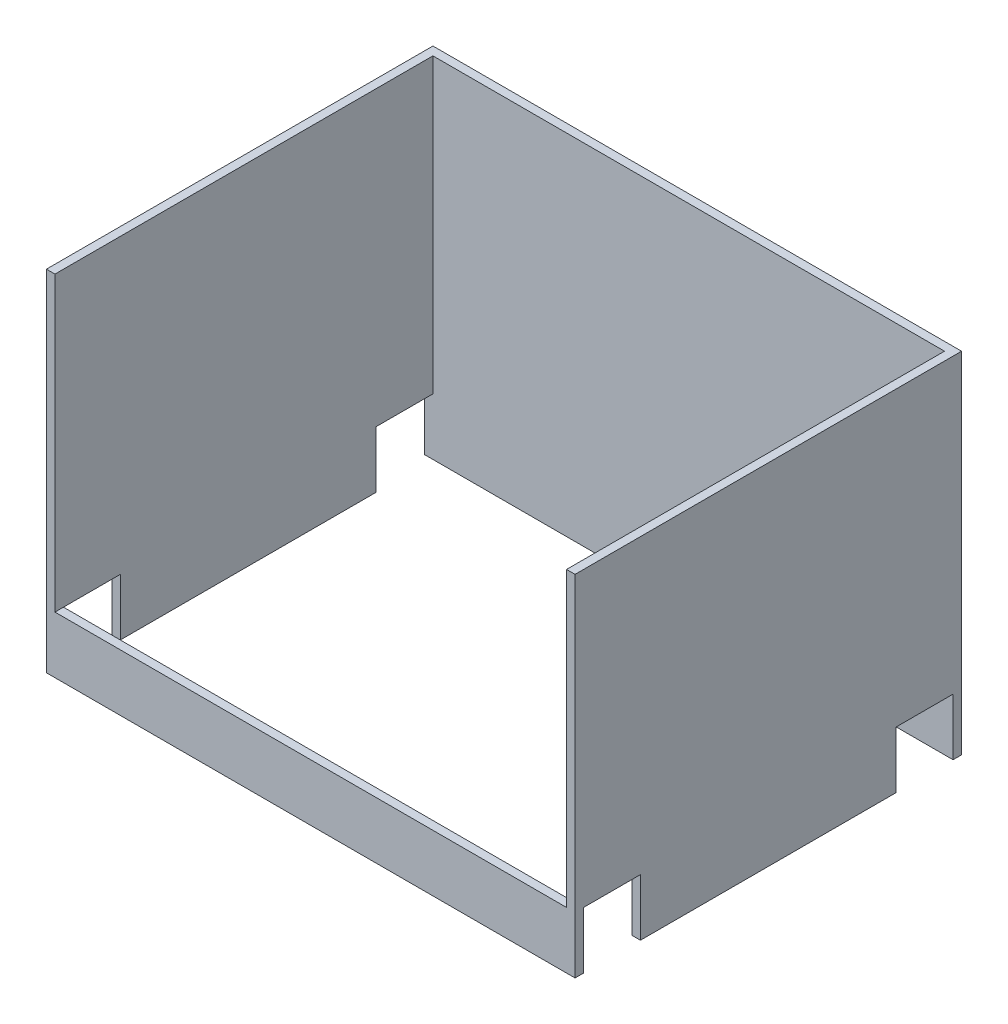
ISO-10303-21;
HEADER;
FILE_DESCRIPTION(('STEP AP214'),'2;1');
FILE_NAME('part.step','',(''),(''),'','','');
FILE_SCHEMA(('AUTOMOTIVE_DESIGN { 1 0 10303 214 1 1 1 1 }'));
ENDSEC;
DATA;
#1=APPLICATION_CONTEXT('core data for automotive mechanical design processes');
#2=APPLICATION_PROTOCOL_DEFINITION('international standard','automotive_design',2000,#1);
#3=PRODUCT_CONTEXT('',#1,'mechanical');
#4=PRODUCT('Part','Part','',(#3));
#5=PRODUCT_RELATED_PRODUCT_CATEGORY('part','',(#4));
#6=PRODUCT_DEFINITION_FORMATION('','',#4);
#7=PRODUCT_DEFINITION_CONTEXT('part definition',#1,'design');
#8=PRODUCT_DEFINITION('design','',#6,#7);
#9=PRODUCT_DEFINITION_SHAPE('','',#8);
#10=(LENGTH_UNIT() NAMED_UNIT(*) SI_UNIT(.MILLI.,.METRE.));
#11=(NAMED_UNIT(*) PLANE_ANGLE_UNIT() SI_UNIT($,.RADIAN.));
#12=(NAMED_UNIT(*) SI_UNIT($,.STERADIAN.) SOLID_ANGLE_UNIT());
#13=UNCERTAINTY_MEASURE_WITH_UNIT(LENGTH_MEASURE(1.E-05),#10,'distance_accuracy_value','');
#14=(GEOMETRIC_REPRESENTATION_CONTEXT(3) GLOBAL_UNCERTAINTY_ASSIGNED_CONTEXT((#13)) GLOBAL_UNIT_ASSIGNED_CONTEXT((#10,
#11,#12)) REPRESENTATION_CONTEXT('',''));
#15=CARTESIAN_POINT('',(0.,0.,0.));
#16=DIRECTION('',(0.,0.,1.));
#17=DIRECTION('',(1.,0.,0.));
#18=AXIS2_PLACEMENT_3D('',#15,#16,#17);
#19=CARTESIAN_POINT('',(0.,-20.,0.));
#20=DIRECTION('',(0.,1.,0.));
#21=DIRECTION('',(0.,0.,1.));
#22=AXIS2_PLACEMENT_3D('',#19,#20,#21);
#23=PLANE('',#22);
#24=DIRECTION('',(0.,0.,1.));
#25=VECTOR('',#24,1.);
#26=CARTESIAN_POINT('',(-93.,-20.,0.));
#27=LINE('',#26,#25);
#28=CARTESIAN_POINT('',(-93.,-20.,65.));
#29=VERTEX_POINT('',#28);
#30=CARTESIAN_POINT('',(-93.,-20.,68.));
#31=VERTEX_POINT('',#30);
#32=EDGE_CURVE('E197',#29,#31,#27,.T.);
#33=ORIENTED_EDGE('',*,*,#32,.F.);
#34=DIRECTION('',(1.,0.,0.));
#35=VECTOR('',#34,1.);
#36=CARTESIAN_POINT('',(0.,-20.,65.));
#37=LINE('',#36,#35);
#38=CARTESIAN_POINT('',(92.9999999999999,-20.,65.));
#39=VERTEX_POINT('',#38);
#40=EDGE_CURVE('E179',#29,#39,#37,.T.);
#41=ORIENTED_EDGE('',*,*,#40,.T.);
#42=DIRECTION('',(0.,0.,1.));
#43=VECTOR('',#42,1.);
#44=CARTESIAN_POINT('',(93.,-20.,0.));
#45=LINE('',#44,#43);
#46=CARTESIAN_POINT('',(93.,-20.,68.));
#47=VERTEX_POINT('',#46);
#48=EDGE_CURVE('E234',#39,#47,#45,.T.);
#49=ORIENTED_EDGE('',*,*,#48,.T.);
#50=DIRECTION('',(1.,0.,0.));
#51=VECTOR('',#50,1.);
#52=CARTESIAN_POINT('',(0.,-20.,68.));
#53=LINE('',#52,#51);
#54=EDGE_CURVE('E207',#31,#47,#53,.T.);
#55=ORIENTED_EDGE('',*,*,#54,.F.);
#56=EDGE_LOOP('',(#33,#41,#49,#55));
#57=FACE_BOUND('',#56,.T.);
#58=ADVANCED_FACE('F35',(#57),#23,.F.);
#59=CARTESIAN_POINT('',(93.,-20.,-45.));
#60=VERTEX_POINT('',#59);
#61=CARTESIAN_POINT('',(92.9999999999999,-20.,45.));
#62=VERTEX_POINT('',#61);
#63=EDGE_CURVE('E251',#60,#62,#45,.T.);
#64=ORIENTED_EDGE('',*,*,#63,.T.);
#65=DIRECTION('',(-1.,0.,0.));
#66=VECTOR('',#65,1.);
#67=CARTESIAN_POINT('',(0.,-20.,45.));
#68=LINE('',#67,#66);
#69=CARTESIAN_POINT('',(90.,-20.,45.));
#70=VERTEX_POINT('',#69);
#71=EDGE_CURVE('E11',#62,#70,#68,.T.);
#72=ORIENTED_EDGE('',*,*,#71,.T.);
#73=DIRECTION('',(0.,0.,1.));
#74=VECTOR('',#73,1.);
#75=CARTESIAN_POINT('',(90.,-20.,0.));
#76=LINE('',#75,#74);
#77=CARTESIAN_POINT('',(89.9999999999999,-20.0000000000001,-45.));
#78=VERTEX_POINT('',#77);
#79=EDGE_CURVE('E193',#78,#70,#76,.T.);
#80=ORIENTED_EDGE('',*,*,#79,.F.);
#81=DIRECTION('',(1.,0.,0.));
#82=VECTOR('',#81,1.);
#83=CARTESIAN_POINT('',(0.,-20.,-45.));
#84=LINE('',#83,#82);
#85=EDGE_CURVE('E43',#78,#60,#84,.T.);
#86=ORIENTED_EDGE('',*,*,#85,.T.);
#87=EDGE_LOOP('',(#64,#72,#80,#86));
#88=FACE_BOUND('',#87,.T.);
#89=ADVANCED_FACE('F250',(#88),#23,.F.);
#90=CARTESIAN_POINT('',(93.,-20.,-68.));
#91=VERTEX_POINT('',#90);
#92=CARTESIAN_POINT('',(92.9999999999999,-20.0000000000001,-65.));
#93=VERTEX_POINT('',#92);
#94=EDGE_CURVE('E213',#91,#93,#45,.T.);
#95=ORIENTED_EDGE('',*,*,#94,.T.);
#96=DIRECTION('',(1.,0.,0.));
#97=VECTOR('',#96,1.);
#98=CARTESIAN_POINT('',(0.,-20.,-65.));
#99=LINE('',#98,#97);
#100=CARTESIAN_POINT('',(-93.,-20.0000000000001,-65.));
#101=VERTEX_POINT('',#100);
#102=EDGE_CURVE('E225',#101,#93,#99,.T.);
#103=ORIENTED_EDGE('',*,*,#102,.F.);
#104=CARTESIAN_POINT('',(-93.,-20.,-68.));
#105=VERTEX_POINT('',#104);
#106=EDGE_CURVE('E211',#105,#101,#27,.T.);
#107=ORIENTED_EDGE('',*,*,#106,.F.);
#108=DIRECTION('',(1.,0.,0.));
#109=VECTOR('',#108,1.);
#110=CARTESIAN_POINT('',(0.,-20.,-68.));
#111=LINE('',#110,#109);
#112=EDGE_CURVE('E209',#105,#91,#111,.T.);
#113=ORIENTED_EDGE('',*,*,#112,.T.);
#114=EDGE_LOOP('',(#95,#103,#107,#113));
#115=FACE_BOUND('',#114,.T.);
#116=ADVANCED_FACE('F387',(#115),#23,.F.);
#117=CARTESIAN_POINT('',(0.,0.,0.));
#118=DIRECTION('',(0.,1.,0.));
#119=DIRECTION('',(0.,0.,1.));
#120=AXIS2_PLACEMENT_3D('',#117,#118,#119);
#121=PLANE('',#120);
#122=DIRECTION('',(1.,0.,0.));
#123=VECTOR('',#122,1.);
#124=CARTESIAN_POINT('',(0.,0.,68.));
#125=LINE('',#124,#123);
#126=CARTESIAN_POINT('',(-90.,0.,68.));
#127=VERTEX_POINT('',#126);
#128=CARTESIAN_POINT('',(90.,0.,68.));
#129=VERTEX_POINT('',#128);
#130=EDGE_CURVE('E228',#127,#129,#125,.T.);
#131=ORIENTED_EDGE('',*,*,#130,.T.);
#132=DIRECTION('',(0.,0.,-1.));
#133=VECTOR('',#132,1.);
#134=CARTESIAN_POINT('',(90.,0.,0.));
#135=LINE('',#134,#133);
#136=CARTESIAN_POINT('',(89.9999999999999,0.,65.));
#137=VERTEX_POINT('',#136);
#138=EDGE_CURVE('E268',#129,#137,#135,.T.);
#139=ORIENTED_EDGE('',*,*,#138,.T.);
#140=DIRECTION('',(1.,0.,0.));
#141=VECTOR('',#140,1.);
#142=CARTESIAN_POINT('',(0.,0.,65.));
#143=LINE('',#142,#141);
#144=CARTESIAN_POINT('',(-90.,0.,65.));
#145=VERTEX_POINT('',#144);
#146=EDGE_CURVE('E231',#145,#137,#143,.T.);
#147=ORIENTED_EDGE('',*,*,#146,.F.);
#148=DIRECTION('',(0.,0.,-1.));
#149=VECTOR('',#148,1.);
#150=CARTESIAN_POINT('',(-90.,0.,0.));
#151=LINE('',#150,#149);
#152=EDGE_CURVE('E272',#127,#145,#151,.T.);
#153=ORIENTED_EDGE('',*,*,#152,.F.);
#154=EDGE_LOOP('',(#131,#139,#147,#153));
#155=FACE_BOUND('',#154,.T.);
#156=ADVANCED_FACE('F365',(#155),#121,.T.);
#157=CARTESIAN_POINT('',(90.,-20.,0.));
#158=DIRECTION('',(-1.,0.,0.));
#159=DIRECTION('',(0.,0.,1.));
#160=AXIS2_PLACEMENT_3D('',#157,#158,#159);
#161=PLANE('',#160);
#162=DIRECTION('',(0.,0.,-1.));
#163=VECTOR('',#162,1.);
#164=CARTESIAN_POINT('',(90.,0.,0.));
#165=LINE('',#164,#163);
#166=CARTESIAN_POINT('',(89.9999999999999,0.,45.));
#167=VERTEX_POINT('',#166);
#168=EDGE_CURVE('E304',#137,#167,#165,.T.);
#169=ORIENTED_EDGE('',*,*,#168,.F.);
#170=ORIENTED_EDGE('',*,*,#138,.F.);
#171=DIRECTION('',(0.,-1.,0.));
#172=VECTOR('',#171,1.);
#173=CARTESIAN_POINT('',(90.,103.,68.));
#174=LINE('',#173,#172);
#175=CARTESIAN_POINT('',(90.,103.,68.));
#176=VERTEX_POINT('',#175);
#177=EDGE_CURVE('E265',#176,#129,#174,.T.);
#178=ORIENTED_EDGE('',*,*,#177,.F.);
#179=DIRECTION('',(0.,0.,-1.));
#180=VECTOR('',#179,1.);
#181=CARTESIAN_POINT('',(90.,103.,0.));
#182=LINE('',#181,#180);
#183=CARTESIAN_POINT('',(90.,103.,-65.));
#184=VERTEX_POINT('',#183);
#185=EDGE_CURVE('E287',#176,#184,#182,.T.);
#186=ORIENTED_EDGE('',*,*,#185,.T.);
#187=DIRECTION('',(0.,1.,0.));
#188=VECTOR('',#187,1.);
#189=CARTESIAN_POINT('',(90.,-20.,-65.));
#190=LINE('',#189,#188);
#191=CARTESIAN_POINT('',(89.9999999999999,0.,-65.));
#192=VERTEX_POINT('',#191);
#193=EDGE_CURVE('E235',#192,#184,#190,.T.);
#194=ORIENTED_EDGE('',*,*,#193,.F.);
#195=DIRECTION('',(0.,0.,-1.));
#196=VECTOR('',#195,1.);
#197=CARTESIAN_POINT('',(90.,0.,0.));
#198=LINE('',#197,#196);
#199=CARTESIAN_POINT('',(89.9999999999999,0.,-45.));
#200=VERTEX_POINT('',#199);
#201=EDGE_CURVE('E275',#200,#192,#198,.T.);
#202=ORIENTED_EDGE('',*,*,#201,.F.);
#203=DIRECTION('',(0.,1.,0.));
#204=VECTOR('',#203,1.);
#205=CARTESIAN_POINT('',(90.,-20.0000000000001,-45.));
#206=LINE('',#205,#204);
#207=EDGE_CURVE('E320',#78,#200,#206,.T.);
#208=ORIENTED_EDGE('',*,*,#207,.F.);
#209=ORIENTED_EDGE('',*,*,#79,.T.);
#210=DIRECTION('',(0.,-1.,0.));
#211=VECTOR('',#210,1.);
#212=CARTESIAN_POINT('',(90.,-20.,45.));
#213=LINE('',#212,#211);
#214=EDGE_CURVE('E58',#167,#70,#213,.T.);
#215=ORIENTED_EDGE('',*,*,#214,.F.);
#216=EDGE_LOOP('',(#169,#170,#178,#186,#194,#202,#208,#209,#215));
#217=FACE_BOUND('',#216,.T.);
#218=ADVANCED_FACE('F369',(#217),#161,.T.);
#219=CARTESIAN_POINT('',(0.,-20.,-65.));
#220=DIRECTION('',(0.,0.,1.));
#221=DIRECTION('',(1.,0.,0.));
#222=AXIS2_PLACEMENT_3D('',#219,#220,#221);
#223=PLANE('',#222);
#224=DIRECTION('',(0.,1.,0.));
#225=VECTOR('',#224,1.);
#226=CARTESIAN_POINT('',(-90.,-20.,-65.));
#227=LINE('',#226,#225);
#228=CARTESIAN_POINT('',(-90.,0.,-65.));
#229=VERTEX_POINT('',#228);
#230=CARTESIAN_POINT('',(-90.,103.,-65.));
#231=VERTEX_POINT('',#230);
#232=EDGE_CURVE('E237',#229,#231,#227,.T.);
#233=ORIENTED_EDGE('',*,*,#232,.F.);
#234=DIRECTION('',(1.,0.,0.));
#235=VECTOR('',#234,1.);
#236=CARTESIAN_POINT('',(-93.,0.,-65.));
#237=LINE('',#236,#235);
#238=CARTESIAN_POINT('',(-93.,0.,-65.));
#239=VERTEX_POINT('',#238);
#240=EDGE_CURVE('E325',#239,#229,#237,.T.);
#241=ORIENTED_EDGE('',*,*,#240,.F.);
#242=DIRECTION('',(0.,1.,0.));
#243=VECTOR('',#242,1.);
#244=CARTESIAN_POINT('',(-93.,-20.0000000000001,-65.));
#245=LINE('',#244,#243);
#246=EDGE_CURVE('E338',#101,#239,#245,.T.);
#247=ORIENTED_EDGE('',*,*,#246,.F.);
#248=ORIENTED_EDGE('',*,*,#102,.T.);
#249=DIRECTION('',(0.,-1.,0.));
#250=VECTOR('',#249,1.);
#251=CARTESIAN_POINT('',(93.,-20.0000000000001,-65.));
#252=LINE('',#251,#250);
#253=CARTESIAN_POINT('',(92.9999999999999,0.,-65.));
#254=VERTEX_POINT('',#253);
#255=EDGE_CURVE('E317',#254,#93,#252,.T.);
#256=ORIENTED_EDGE('',*,*,#255,.F.);
#257=EDGE_CURVE('E328',#192,#254,#237,.T.);
#258=ORIENTED_EDGE('',*,*,#257,.F.);
#259=ORIENTED_EDGE('',*,*,#193,.T.);
#260=DIRECTION('',(-1.,0.,0.));
#261=VECTOR('',#260,1.);
#262=CARTESIAN_POINT('',(0.,103.,-65.));
#263=LINE('',#262,#261);
#264=EDGE_CURVE('E290',#184,#231,#263,.T.);
#265=ORIENTED_EDGE('',*,*,#264,.T.);
#266=EDGE_LOOP('',(#233,#241,#247,#248,#256,#258,#259,#265));
#267=FACE_BOUND('',#266,.T.);
#268=ADVANCED_FACE('F404',(#267),#223,.T.);
#269=CARTESIAN_POINT('',(-90.,-20.,0.));
#270=DIRECTION('',(-1.,0.,0.));
#271=DIRECTION('',(0.,0.,1.));
#272=AXIS2_PLACEMENT_3D('',#269,#270,#271);
#273=PLANE('',#272);
#274=ORIENTED_EDGE('',*,*,#152,.T.);
#275=DIRECTION('',(0.,0.,-1.));
#276=VECTOR('',#275,1.);
#277=CARTESIAN_POINT('',(-90.,0.,0.));
#278=LINE('',#277,#276);
#279=CARTESIAN_POINT('',(-90.,0.,45.));
#280=VERTEX_POINT('',#279);
#281=EDGE_CURVE('E306',#145,#280,#278,.T.);
#282=ORIENTED_EDGE('',*,*,#281,.T.);
#283=DIRECTION('',(0.,-1.,0.));
#284=VECTOR('',#283,1.);
#285=CARTESIAN_POINT('',(-90.,-20.,45.));
#286=LINE('',#285,#284);
#287=CARTESIAN_POINT('',(-90.,-20.,45.));
#288=VERTEX_POINT('',#287);
#289=EDGE_CURVE('E313',#280,#288,#286,.T.);
#290=ORIENTED_EDGE('',*,*,#289,.T.);
#291=DIRECTION('',(0.,0.,1.));
#292=VECTOR('',#291,1.);
#293=CARTESIAN_POINT('',(-90.,-20.,0.));
#294=LINE('',#293,#292);
#295=CARTESIAN_POINT('',(-90.,-20.,-45.));
#296=VERTEX_POINT('',#295);
#297=EDGE_CURVE('E192',#296,#288,#294,.T.);
#298=ORIENTED_EDGE('',*,*,#297,.F.);
#299=DIRECTION('',(0.,1.,0.));
#300=VECTOR('',#299,1.);
#301=CARTESIAN_POINT('',(-90.,-20.0000000000001,-45.));
#302=LINE('',#301,#300);
#303=CARTESIAN_POINT('',(-90.,0.,-45.));
#304=VERTEX_POINT('',#303);
#305=EDGE_CURVE('E50',#296,#304,#302,.T.);
#306=ORIENTED_EDGE('',*,*,#305,.T.);
#307=DIRECTION('',(0.,0.,-1.));
#308=VECTOR('',#307,1.);
#309=CARTESIAN_POINT('',(-90.,0.,0.));
#310=LINE('',#309,#308);
#311=EDGE_CURVE('E299',#304,#229,#310,.T.);
#312=ORIENTED_EDGE('',*,*,#311,.T.);
#313=ORIENTED_EDGE('',*,*,#232,.T.);
#314=DIRECTION('',(0.,0.,-1.));
#315=VECTOR('',#314,1.);
#316=CARTESIAN_POINT('',(-90.,103.,0.));
#317=LINE('',#316,#315);
#318=CARTESIAN_POINT('',(-90.,103.,68.));
#319=VERTEX_POINT('',#318);
#320=EDGE_CURVE('E293',#319,#231,#317,.T.);
#321=ORIENTED_EDGE('',*,*,#320,.F.);
#322=DIRECTION('',(0.,-1.,0.));
#323=VECTOR('',#322,1.);
#324=CARTESIAN_POINT('',(-90.,103.,68.));
#325=LINE('',#324,#323);
#326=EDGE_CURVE('E232',#319,#127,#325,.T.);
#327=ORIENTED_EDGE('',*,*,#326,.T.);
#328=EDGE_LOOP('',(#274,#282,#290,#298,#306,#312,#313,#321,#327));
#329=FACE_BOUND('',#328,.T.);
#330=ADVANCED_FACE('F357',(#329),#273,.F.);
#331=CARTESIAN_POINT('',(93.,-20.,0.));
#332=DIRECTION('',(-1.,0.,0.));
#333=DIRECTION('',(0.,0.,1.));
#334=AXIS2_PLACEMENT_3D('',#331,#332,#333);
#335=PLANE('',#334);
#336=ORIENTED_EDGE('',*,*,#48,.F.);
#337=DIRECTION('',(0.,1.,0.));
#338=VECTOR('',#337,1.);
#339=CARTESIAN_POINT('',(93.,-20.,65.));
#340=LINE('',#339,#338);
#341=CARTESIAN_POINT('',(92.9999999999999,0.,65.));
#342=VERTEX_POINT('',#341);
#343=EDGE_CURVE('E188',#39,#342,#340,.T.);
#344=ORIENTED_EDGE('',*,*,#343,.T.);
#345=DIRECTION('',(0.,0.,-1.));
#346=VECTOR('',#345,1.);
#347=CARTESIAN_POINT('',(93.,0.,0.));
#348=LINE('',#347,#346);
#349=CARTESIAN_POINT('',(92.9999999999999,0.,45.));
#350=VERTEX_POINT('',#349);
#351=EDGE_CURVE('E309',#342,#350,#348,.T.);
#352=ORIENTED_EDGE('',*,*,#351,.T.);
#353=DIRECTION('',(0.,-1.,0.));
#354=VECTOR('',#353,1.);
#355=CARTESIAN_POINT('',(93.,-20.,45.));
#356=LINE('',#355,#354);
#357=EDGE_CURVE('E260',#350,#62,#356,.T.);
#358=ORIENTED_EDGE('',*,*,#357,.T.);
#359=ORIENTED_EDGE('',*,*,#63,.F.);
#360=DIRECTION('',(0.,1.,0.));
#361=VECTOR('',#360,1.);
#362=CARTESIAN_POINT('',(93.,-20.0000000000001,-45.));
#363=LINE('',#362,#361);
#364=CARTESIAN_POINT('',(92.9999999999999,0.,-45.));
#365=VERTEX_POINT('',#364);
#366=EDGE_CURVE('E258',#60,#365,#363,.T.);
#367=ORIENTED_EDGE('',*,*,#366,.T.);
#368=DIRECTION('',(0.,0.,-1.));
#369=VECTOR('',#368,1.);
#370=CARTESIAN_POINT('',(93.,0.,0.));
#371=LINE('',#370,#369);
#372=EDGE_CURVE('E302',#365,#254,#371,.T.);
#373=ORIENTED_EDGE('',*,*,#372,.T.);
#374=ORIENTED_EDGE('',*,*,#255,.T.);
#375=ORIENTED_EDGE('',*,*,#94,.F.);
#376=DIRECTION('',(0.,1.,0.));
#377=VECTOR('',#376,1.);
#378=CARTESIAN_POINT('',(93.,-20.,-68.));
#379=LINE('',#378,#377);
#380=CARTESIAN_POINT('',(93.,103.,-68.));
#381=VERTEX_POINT('',#380);
#382=EDGE_CURVE('E227',#91,#381,#379,.T.);
#383=ORIENTED_EDGE('',*,*,#382,.T.);
#384=DIRECTION('',(0.,0.,-1.));
#385=VECTOR('',#384,1.);
#386=CARTESIAN_POINT('',(93.,103.,0.));
#387=LINE('',#386,#385);
#388=CARTESIAN_POINT('',(93.,103.,68.));
#389=VERTEX_POINT('',#388);
#390=EDGE_CURVE('E281',#389,#381,#387,.T.);
#391=ORIENTED_EDGE('',*,*,#390,.F.);
#392=DIRECTION('',(0.,1.,0.));
#393=VECTOR('',#392,1.);
#394=CARTESIAN_POINT('',(93.,-20.,68.));
#395=LINE('',#394,#393);
#396=EDGE_CURVE('E239',#47,#389,#395,.T.);
#397=ORIENTED_EDGE('',*,*,#396,.F.);
#398=EDGE_LOOP('',(#336,#344,#352,#358,#359,#367,#373,#374,#375,#383,#391,#397));
#399=FACE_BOUND('',#398,.T.);
#400=ADVANCED_FACE('F37',(#399),#335,.F.);
#401=CARTESIAN_POINT('',(0.,-20.,68.));
#402=DIRECTION('',(0.,0.,1.));
#403=DIRECTION('',(1.,0.,0.));
#404=AXIS2_PLACEMENT_3D('',#401,#402,#403);
#405=PLANE('',#404);
#406=ORIENTED_EDGE('',*,*,#130,.F.);
#407=ORIENTED_EDGE('',*,*,#326,.F.);
#408=DIRECTION('',(1.,0.,0.));
#409=VECTOR('',#408,1.);
#410=CARTESIAN_POINT('',(0.,103.,68.));
#411=LINE('',#410,#409);
#412=CARTESIAN_POINT('',(-93.,103.,68.));
#413=VERTEX_POINT('',#412);
#414=EDGE_CURVE('E271',#413,#319,#411,.T.);
#415=ORIENTED_EDGE('',*,*,#414,.F.);
#416=DIRECTION('',(0.,1.,0.));
#417=VECTOR('',#416,1.);
#418=CARTESIAN_POINT('',(-93.,-20.,68.));
#419=LINE('',#418,#417);
#420=EDGE_CURVE('E241',#31,#413,#419,.T.);
#421=ORIENTED_EDGE('',*,*,#420,.F.);
#422=ORIENTED_EDGE('',*,*,#54,.T.);
#423=ORIENTED_EDGE('',*,*,#396,.T.);
#424=DIRECTION('',(1.,0.,0.));
#425=VECTOR('',#424,1.);
#426=CARTESIAN_POINT('',(0.,103.,68.));
#427=LINE('',#426,#425);
#428=EDGE_CURVE('E284',#176,#389,#427,.T.);
#429=ORIENTED_EDGE('',*,*,#428,.F.);
#430=ORIENTED_EDGE('',*,*,#177,.T.);
#431=EDGE_LOOP('',(#406,#407,#415,#421,#422,#423,#429,#430));
#432=FACE_BOUND('',#431,.T.);
#433=ADVANCED_FACE('F401',(#432),#405,.T.);
#434=CARTESIAN_POINT('',(-93.,-20.,0.));
#435=DIRECTION('',(-1.,0.,0.));
#436=DIRECTION('',(0.,0.,1.));
#437=AXIS2_PLACEMENT_3D('',#434,#435,#436);
#438=PLANE('',#437);
#439=DIRECTION('',(0.,-1.,0.));
#440=VECTOR('',#439,1.);
#441=CARTESIAN_POINT('',(-93.,-20.,65.));
#442=LINE('',#441,#440);
#443=CARTESIAN_POINT('',(-93.,0.,65.));
#444=VERTEX_POINT('',#443);
#445=EDGE_CURVE('E184',#444,#29,#442,.T.);
#446=ORIENTED_EDGE('',*,*,#445,.T.);
#447=ORIENTED_EDGE('',*,*,#32,.T.);
#448=ORIENTED_EDGE('',*,*,#420,.T.);
#449=DIRECTION('',(0.,0.,1.));
#450=VECTOR('',#449,1.);
#451=CARTESIAN_POINT('',(-93.,103.,0.));
#452=LINE('',#451,#450);
#453=CARTESIAN_POINT('',(-93.,103.,-68.));
#454=VERTEX_POINT('',#453);
#455=EDGE_CURVE('E267',#454,#413,#452,.T.);
#456=ORIENTED_EDGE('',*,*,#455,.F.);
#457=DIRECTION('',(0.,1.,0.));
#458=VECTOR('',#457,1.);
#459=CARTESIAN_POINT('',(-93.,-20.,-68.));
#460=LINE('',#459,#458);
#461=EDGE_CURVE('E243',#105,#454,#460,.T.);
#462=ORIENTED_EDGE('',*,*,#461,.F.);
#463=ORIENTED_EDGE('',*,*,#106,.T.);
#464=ORIENTED_EDGE('',*,*,#246,.T.);
#465=DIRECTION('',(0.,0.,1.));
#466=VECTOR('',#465,1.);
#467=CARTESIAN_POINT('',(-93.,0.,-65.));
#468=LINE('',#467,#466);
#469=CARTESIAN_POINT('',(-93.,0.,-45.));
#470=VERTEX_POINT('',#469);
#471=EDGE_CURVE('E335',#239,#470,#468,.T.);
#472=ORIENTED_EDGE('',*,*,#471,.T.);
#473=DIRECTION('',(0.,-1.,0.));
#474=VECTOR('',#473,1.);
#475=CARTESIAN_POINT('',(-93.,-20.0000000000001,-45.));
#476=LINE('',#475,#474);
#477=CARTESIAN_POINT('',(-93.,-20.0000000000001,-45.));
#478=VERTEX_POINT('',#477);
#479=EDGE_CURVE('E332',#470,#478,#476,.T.);
#480=ORIENTED_EDGE('',*,*,#479,.T.);
#481=CARTESIAN_POINT('',(-93.,-20.,45.));
#482=VERTEX_POINT('',#481);
#483=EDGE_CURVE('E208',#478,#482,#27,.T.);
#484=ORIENTED_EDGE('',*,*,#483,.T.);
#485=DIRECTION('',(0.,1.,0.));
#486=VECTOR('',#485,1.);
#487=CARTESIAN_POINT('',(-93.,-20.,45.));
#488=LINE('',#487,#486);
#489=CARTESIAN_POINT('',(-93.,0.,45.));
#490=VERTEX_POINT('',#489);
#491=EDGE_CURVE('E202',#482,#490,#488,.T.);
#492=ORIENTED_EDGE('',*,*,#491,.T.);
#493=DIRECTION('',(0.,0.,1.));
#494=VECTOR('',#493,1.);
#495=CARTESIAN_POINT('',(-93.,0.,65.));
#496=LINE('',#495,#494);
#497=EDGE_CURVE('E201',#490,#444,#496,.T.);
#498=ORIENTED_EDGE('',*,*,#497,.T.);
#499=EDGE_LOOP('',(#446,#447,#448,#456,#462,#463,#464,#472,#480,#484,#492,#498));
#500=FACE_BOUND('',#499,.T.);
#501=ADVANCED_FACE('F196',(#500),#438,.T.);
#502=CARTESIAN_POINT('',(0.,-20.,-68.));
#503=DIRECTION('',(0.,0.,1.));
#504=DIRECTION('',(1.,0.,0.));
#505=AXIS2_PLACEMENT_3D('',#502,#503,#504);
#506=PLANE('',#505);
#507=ORIENTED_EDGE('',*,*,#461,.T.);
#508=DIRECTION('',(-1.,0.,0.));
#509=VECTOR('',#508,1.);
#510=CARTESIAN_POINT('',(0.,103.,-68.));
#511=LINE('',#510,#509);
#512=EDGE_CURVE('E278',#381,#454,#511,.T.);
#513=ORIENTED_EDGE('',*,*,#512,.F.);
#514=ORIENTED_EDGE('',*,*,#382,.F.);
#515=ORIENTED_EDGE('',*,*,#112,.F.);
#516=EDGE_LOOP('',(#507,#513,#514,#515));
#517=FACE_BOUND('',#516,.T.);
#518=ADVANCED_FACE('F393',(#517),#506,.F.);
#519=CARTESIAN_POINT('',(0.,-20.,65.));
#520=DIRECTION('',(0.,0.,1.));
#521=DIRECTION('',(1.,0.,0.));
#522=AXIS2_PLACEMENT_3D('',#519,#520,#521);
#523=PLANE('',#522);
#524=ORIENTED_EDGE('',*,*,#146,.T.);
#525=DIRECTION('',(1.,0.,0.));
#526=VECTOR('',#525,1.);
#527=CARTESIAN_POINT('',(-93.,0.,65.));
#528=LINE('',#527,#526);
#529=EDGE_CURVE('E346',#137,#342,#528,.T.);
#530=ORIENTED_EDGE('',*,*,#529,.T.);
#531=ORIENTED_EDGE('',*,*,#343,.F.);
#532=ORIENTED_EDGE('',*,*,#40,.F.);
#533=ORIENTED_EDGE('',*,*,#445,.F.);
#534=EDGE_CURVE('E324',#444,#145,#528,.T.);
#535=ORIENTED_EDGE('',*,*,#534,.T.);
#536=EDGE_LOOP('',(#524,#530,#531,#532,#533,#535));
#537=FACE_BOUND('',#536,.T.);
#538=ADVANCED_FACE('F182',(#537),#523,.F.);
#539=ORIENTED_EDGE('',*,*,#297,.T.);
#540=DIRECTION('',(1.,0.,0.));
#541=VECTOR('',#540,1.);
#542=CARTESIAN_POINT('',(-93.,-20.,45.));
#543=LINE('',#542,#541);
#544=EDGE_CURVE('E340',#482,#288,#543,.T.);
#545=ORIENTED_EDGE('',*,*,#544,.F.);
#546=ORIENTED_EDGE('',*,*,#483,.F.);
#547=DIRECTION('',(1.,0.,0.));
#548=VECTOR('',#547,1.);
#549=CARTESIAN_POINT('',(-93.,-20.0000000000001,-45.));
#550=LINE('',#549,#548);
#551=EDGE_CURVE('E203',#478,#296,#550,.T.);
#552=ORIENTED_EDGE('',*,*,#551,.T.);
#553=EDGE_LOOP('',(#539,#545,#546,#552));
#554=FACE_BOUND('',#553,.T.);
#555=ADVANCED_FACE('F354',(#554),#23,.F.);
#556=CARTESIAN_POINT('',(0.,103.,0.));
#557=DIRECTION('',(0.,1.,0.));
#558=DIRECTION('',(0.,0.,1.));
#559=AXIS2_PLACEMENT_3D('',#556,#557,#558);
#560=PLANE('',#559);
#561=ORIENTED_EDGE('',*,*,#414,.T.);
#562=ORIENTED_EDGE('',*,*,#320,.T.);
#563=ORIENTED_EDGE('',*,*,#264,.F.);
#564=ORIENTED_EDGE('',*,*,#185,.F.);
#565=ORIENTED_EDGE('',*,*,#428,.T.);
#566=ORIENTED_EDGE('',*,*,#390,.T.);
#567=ORIENTED_EDGE('',*,*,#512,.T.);
#568=ORIENTED_EDGE('',*,*,#455,.T.);
#569=EDGE_LOOP('',(#561,#562,#563,#564,#565,#566,#567,#568));
#570=FACE_BOUND('',#569,.T.);
#571=ADVANCED_FACE('F397',(#570),#560,.T.);
#572=CARTESIAN_POINT('',(-93.,-20.0000000000001,-45.));
#573=DIRECTION('',(0.,0.,1.));
#574=DIRECTION('',(0.,-1.,0.));
#575=AXIS2_PLACEMENT_3D('',#572,#573,#574);
#576=PLANE('',#575);
#577=ORIENTED_EDGE('',*,*,#207,.T.);
#578=DIRECTION('',(1.,0.,0.));
#579=VECTOR('',#578,1.);
#580=CARTESIAN_POINT('',(-93.,0.,-45.));
#581=LINE('',#580,#579);
#582=EDGE_CURVE('E327',#200,#365,#581,.T.);
#583=ORIENTED_EDGE('',*,*,#582,.T.);
#584=ORIENTED_EDGE('',*,*,#366,.F.);
#585=ORIENTED_EDGE('',*,*,#85,.F.);
#586=EDGE_LOOP('',(#577,#583,#584,#585));
#587=FACE_BOUND('',#586,.T.);
#588=ADVANCED_FACE('F379',(#587),#576,.F.);
#589=CARTESIAN_POINT('',(-93.,0.,-65.));
#590=DIRECTION('',(0.,1.,0.));
#591=DIRECTION('',(0.,0.,1.));
#592=AXIS2_PLACEMENT_3D('',#589,#590,#591);
#593=PLANE('',#592);
#594=ORIENTED_EDGE('',*,*,#201,.T.);
#595=ORIENTED_EDGE('',*,*,#257,.T.);
#596=ORIENTED_EDGE('',*,*,#372,.F.);
#597=ORIENTED_EDGE('',*,*,#582,.F.);
#598=EDGE_LOOP('',(#594,#595,#596,#597));
#599=FACE_BOUND('',#598,.T.);
#600=ADVANCED_FACE('F381',(#599),#593,.F.);
#601=EDGE_CURVE('E329',#470,#304,#581,.T.);
#602=ORIENTED_EDGE('',*,*,#601,.F.);
#603=ORIENTED_EDGE('',*,*,#471,.F.);
#604=ORIENTED_EDGE('',*,*,#240,.T.);
#605=ORIENTED_EDGE('',*,*,#311,.F.);
#606=EDGE_LOOP('',(#602,#603,#604,#605));
#607=FACE_BOUND('',#606,.T.);
#608=ADVANCED_FACE('F407',(#607),#593,.F.);
#609=ORIENTED_EDGE('',*,*,#551,.F.);
#610=ORIENTED_EDGE('',*,*,#479,.F.);
#611=ORIENTED_EDGE('',*,*,#601,.T.);
#612=ORIENTED_EDGE('',*,*,#305,.F.);
#613=EDGE_LOOP('',(#609,#610,#611,#612));
#614=FACE_BOUND('',#613,.T.);
#615=ADVANCED_FACE('F409',(#614),#576,.F.);
#616=CARTESIAN_POINT('',(-93.,-20.,45.));
#617=DIRECTION('',(0.,0.,-1.));
#618=DIRECTION('',(-1.,0.,0.));
#619=AXIS2_PLACEMENT_3D('',#616,#617,#618);
#620=PLANE('',#619);
#621=DIRECTION('',(1.,0.,0.));
#622=VECTOR('',#621,1.);
#623=CARTESIAN_POINT('',(-93.,0.,45.));
#624=LINE('',#623,#622);
#625=EDGE_CURVE('E343',#490,#280,#624,.T.);
#626=ORIENTED_EDGE('',*,*,#625,.F.);
#627=ORIENTED_EDGE('',*,*,#491,.F.);
#628=ORIENTED_EDGE('',*,*,#544,.T.);
#629=ORIENTED_EDGE('',*,*,#289,.F.);
#630=EDGE_LOOP('',(#626,#627,#628,#629));
#631=FACE_BOUND('',#630,.T.);
#632=ADVANCED_FACE('F352',(#631),#620,.F.);
#633=CARTESIAN_POINT('',(-93.,0.,65.));
#634=DIRECTION('',(0.,1.,0.));
#635=DIRECTION('',(0.,0.,1.));
#636=AXIS2_PLACEMENT_3D('',#633,#634,#635);
#637=PLANE('',#636);
#638=ORIENTED_EDGE('',*,*,#534,.F.);
#639=ORIENTED_EDGE('',*,*,#497,.F.);
#640=ORIENTED_EDGE('',*,*,#625,.T.);
#641=ORIENTED_EDGE('',*,*,#281,.F.);
#642=EDGE_LOOP('',(#638,#639,#640,#641));
#643=FACE_BOUND('',#642,.T.);
#644=ADVANCED_FACE('F359',(#643),#637,.F.);
#645=ORIENTED_EDGE('',*,*,#168,.T.);
#646=EDGE_CURVE('E342',#167,#350,#624,.T.);
#647=ORIENTED_EDGE('',*,*,#646,.T.);
#648=ORIENTED_EDGE('',*,*,#351,.F.);
#649=ORIENTED_EDGE('',*,*,#529,.F.);
#650=EDGE_LOOP('',(#645,#647,#648,#649));
#651=FACE_BOUND('',#650,.T.);
#652=ADVANCED_FACE('F373',(#651),#637,.F.);
#653=ORIENTED_EDGE('',*,*,#214,.T.);
#654=ORIENTED_EDGE('',*,*,#71,.F.);
#655=ORIENTED_EDGE('',*,*,#357,.F.);
#656=ORIENTED_EDGE('',*,*,#646,.F.);
#657=EDGE_LOOP('',(#653,#654,#655,#656));
#658=FACE_BOUND('',#657,.T.);
#659=ADVANCED_FACE('F374',(#658),#620,.F.);
#660=CLOSED_SHELL('',(#58,#89,#116,#156,#218,#268,#330,#400,#433,#501,#518,#538,#555,#571,#588,
#600,#608,#615,#632,#644,#652,#659));
#661=MANIFOLD_SOLID_BREP('B2',#660);
#662=ADVANCED_BREP_SHAPE_REPRESENTATION('',(#18,#661),#14);
#663=SHAPE_DEFINITION_REPRESENTATION(#9,#662);
ENDSEC;
END-ISO-10303-21;
